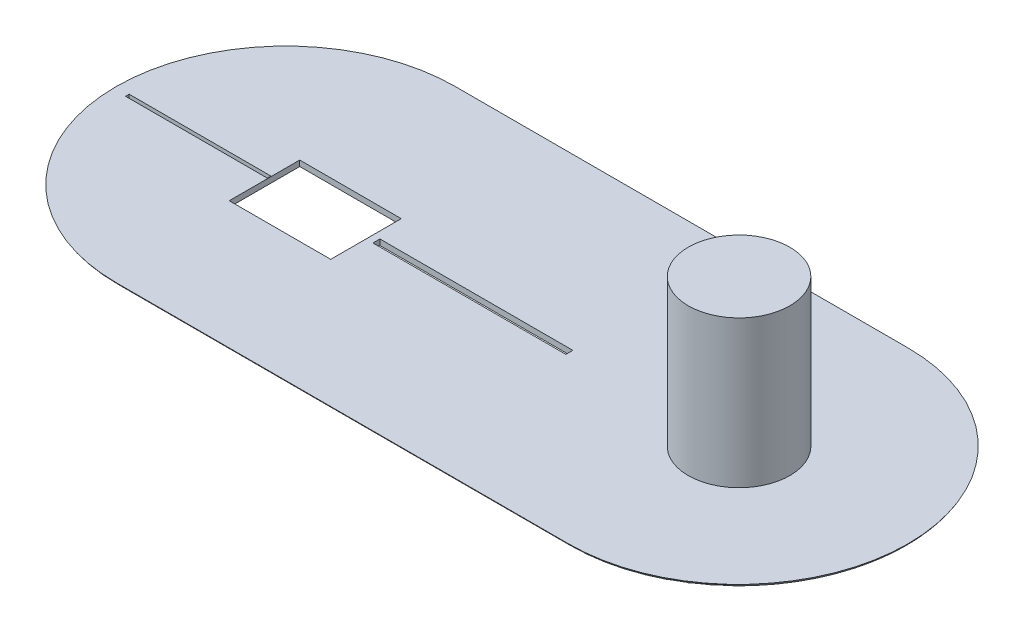
ISO-10303-21;
HEADER;
FILE_DESCRIPTION(('STEP AP214'),'2;1');
FILE_NAME('part.step','',(''),(''),'','','');
FILE_SCHEMA(('AUTOMOTIVE_DESIGN { 1 0 10303 214 1 1 1 1 }'));
ENDSEC;
DATA;
#1=APPLICATION_CONTEXT('core data for automotive mechanical design processes');
#2=APPLICATION_PROTOCOL_DEFINITION('international standard','automotive_design',2000,#1);
#3=PRODUCT_CONTEXT('',#1,'mechanical');
#4=PRODUCT('Part','Part','',(#3));
#5=PRODUCT_RELATED_PRODUCT_CATEGORY('part','',(#4));
#6=PRODUCT_DEFINITION_FORMATION('','',#4);
#7=PRODUCT_DEFINITION_CONTEXT('part definition',#1,'design');
#8=PRODUCT_DEFINITION('design','',#6,#7);
#9=PRODUCT_DEFINITION_SHAPE('','',#8);
#10=(LENGTH_UNIT() NAMED_UNIT(*) SI_UNIT(.MILLI.,.METRE.));
#11=(NAMED_UNIT(*) PLANE_ANGLE_UNIT() SI_UNIT($,.RADIAN.));
#12=(NAMED_UNIT(*) SI_UNIT($,.STERADIAN.) SOLID_ANGLE_UNIT());
#13=UNCERTAINTY_MEASURE_WITH_UNIT(LENGTH_MEASURE(1.E-05),#10,'distance_accuracy_value','');
#14=(GEOMETRIC_REPRESENTATION_CONTEXT(3) GLOBAL_UNCERTAINTY_ASSIGNED_CONTEXT((#13)) GLOBAL_UNIT_ASSIGNED_CONTEXT((#10,
#11,#12)) REPRESENTATION_CONTEXT('',''));
#15=CARTESIAN_POINT('',(0.,0.,0.));
#16=DIRECTION('',(0.,0.,1.));
#17=DIRECTION('',(1.,0.,0.));
#18=AXIS2_PLACEMENT_3D('',#15,#16,#17);
#19=CARTESIAN_POINT('',(-42.3139588100687,1.27,0.));
#20=DIRECTION('',(0.,1.,0.));
#21=DIRECTION('',(0.,0.,1.));
#22=AXIS2_PLACEMENT_3D('',#19,#20,#21);
#23=PLANE('',#22);
#24=DIRECTION('',(0.,0.,1.));
#25=VECTOR('',#24,1.);
#26=CARTESIAN_POINT('',(-77.4616347759732,1.27,0.));
#27=LINE('',#26,#25);
#28=CARTESIAN_POINT('',(-77.4616347759732,1.27,0.));
#29=VERTEX_POINT('',#28);
#30=CARTESIAN_POINT('',(-77.4616347759732,1.27,0.811195954050724));
#31=VERTEX_POINT('',#30);
#32=EDGE_CURVE('E209',#29,#31,#27,.T.);
#33=ORIENTED_EDGE('',*,*,#32,.F.);
#34=DIRECTION('',(-1.,0.,0.));
#35=VECTOR('',#34,1.);
#36=CARTESIAN_POINT('',(-42.3139588100687,1.27,0.));
#37=LINE('',#36,#35);
#38=CARTESIAN_POINT('',(-45.6306337318258,1.27,0.));
#39=VERTEX_POINT('',#38);
#40=EDGE_CURVE('E204',#39,#29,#37,.T.);
#41=ORIENTED_EDGE('',*,*,#40,.F.);
#42=DIRECTION('',(0.,0.,-1.));
#43=VECTOR('',#42,1.);
#44=CARTESIAN_POINT('',(-45.6306337318258,1.27,0.));
#45=LINE('',#44,#43);
#46=CARTESIAN_POINT('',(-45.6306337318258,1.27,0.811195954050724));
#47=VERTEX_POINT('',#46);
#48=EDGE_CURVE('E152',#47,#39,#45,.T.);
#49=ORIENTED_EDGE('',*,*,#48,.F.);
#50=DIRECTION('',(1.,0.,0.));
#51=VECTOR('',#50,1.);
#52=CARTESIAN_POINT('',(-42.3139588100687,1.27,0.811195954050724));
#53=LINE('',#52,#51);
#54=EDGE_CURVE('E207',#31,#47,#53,.T.);
#55=ORIENTED_EDGE('',*,*,#54,.F.);
#56=EDGE_LOOP('',(#33,#41,#49,#55));
#57=FACE_BOUND('',#56,.T.);
#58=DIRECTION('',(0.,0.,1.));
#59=VECTOR('',#58,1.);
#60=CARTESIAN_POINT('',(-21.1665375522872,1.27,0.));
#61=LINE('',#60,#59);
#62=CARTESIAN_POINT('',(-21.1665375522872,1.27,0.));
#63=VERTEX_POINT('',#62);
#64=CARTESIAN_POINT('',(-21.1665375522872,1.27,1.56940879190157));
#65=VERTEX_POINT('',#64);
#66=EDGE_CURVE('E202',#63,#65,#61,.T.);
#67=ORIENTED_EDGE('',*,*,#66,.F.);
#68=DIRECTION('',(-1.,0.,0.));
#69=VECTOR('',#68,1.);
#70=CARTESIAN_POINT('',(-42.3139588100687,1.27,0.));
#71=LINE('',#70,#69);
#72=CARTESIAN_POINT('',(22.1438046169267,1.27,0.));
#73=VERTEX_POINT('',#72);
#74=EDGE_CURVE('E176',#73,#63,#71,.T.);
#75=ORIENTED_EDGE('',*,*,#74,.F.);
#76=DIRECTION('',(0.,0.,-1.));
#77=VECTOR('',#76,1.);
#78=CARTESIAN_POINT('',(22.1438046169267,1.27,0.));
#79=LINE('',#78,#77);
#80=CARTESIAN_POINT('',(22.1438046169267,1.27,1.56940879190157));
#81=VERTEX_POINT('',#80);
#82=EDGE_CURVE('E198',#81,#73,#79,.T.);
#83=ORIENTED_EDGE('',*,*,#82,.F.);
#84=DIRECTION('',(1.,0.,0.));
#85=VECTOR('',#84,1.);
#86=CARTESIAN_POINT('',(-42.3139588100687,1.27,1.56940879190157));
#87=LINE('',#86,#85);
#88=EDGE_CURVE('E200',#65,#81,#87,.T.);
#89=ORIENTED_EDGE('',*,*,#88,.F.);
#90=EDGE_LOOP('',(#67,#75,#83,#89));
#91=FACE_BOUND('',#90,.T.);
#92=DIRECTION('',(0.,0.,1.));
#93=VECTOR('',#92,1.);
#94=CARTESIAN_POINT('',(-45.519073569725,1.27,9.48349138702095));
#95=LINE('',#94,#93);
#96=CARTESIAN_POINT('',(-45.519073569725,1.27,-6.34467380321782));
#97=VERTEX_POINT('',#96);
#98=CARTESIAN_POINT('',(-45.519073569725,1.27,9.48349138702095));
#99=VERTEX_POINT('',#98);
#100=EDGE_CURVE('E212',#97,#99,#95,.T.);
#101=ORIENTED_EDGE('',*,*,#100,.F.);
#102=DIRECTION('',(-1.,0.,0.));
#103=VECTOR('',#102,1.);
#104=CARTESIAN_POINT('',(-45.519073569725,1.27,-6.34467380321782));
#105=LINE('',#104,#103);
#106=CARTESIAN_POINT('',(-22.7265156957812,1.27,-6.34467380321782));
#107=VERTEX_POINT('',#106);
#108=EDGE_CURVE('E220',#107,#97,#105,.T.);
#109=ORIENTED_EDGE('',*,*,#108,.F.);
#110=DIRECTION('',(0.,0.,-1.));
#111=VECTOR('',#110,1.);
#112=CARTESIAN_POINT('',(-22.7265156957812,1.27,9.48349138702095));
#113=LINE('',#112,#111);
#114=CARTESIAN_POINT('',(-22.7265156957812,1.27,9.48349138702095));
#115=VERTEX_POINT('',#114);
#116=EDGE_CURVE('E217',#115,#107,#113,.T.);
#117=ORIENTED_EDGE('',*,*,#116,.F.);
#118=DIRECTION('',(1.,0.,0.));
#119=VECTOR('',#118,1.);
#120=CARTESIAN_POINT('',(-45.519073569725,1.27,9.48349138702095));
#121=LINE('',#120,#119);
#122=EDGE_CURVE('E214',#99,#115,#121,.T.);
#123=ORIENTED_EDGE('',*,*,#122,.F.);
#124=EDGE_LOOP('',(#101,#109,#117,#123));
#125=FACE_BOUND('',#124,.T.);
#126=CARTESIAN_POINT('',(59.4608738266871,1.27,0.));
#127=DIRECTION('',(0.,1.,0.));
#128=DIRECTION('',(0.,0.,1.));
#129=AXIS2_PLACEMENT_3D('',#126,#127,#128);
#130=CIRCLE('',#129,11.4029964034048);
#131=CARTESIAN_POINT('',(59.4608738266871,1.27,11.4029964034048));
#132=VERTEX_POINT('',#131);
#133=EDGE_CURVE('E226',#132,#132,#130,.T.);
#134=ORIENTED_EDGE('',*,*,#133,.F.);
#135=EDGE_LOOP('',(#134));
#136=FACE_BOUND('',#135,.T.);
#137=CARTESIAN_POINT('',(-42.3139588100687,1.27,0.));
#138=DIRECTION('',(0.,1.,0.));
#139=DIRECTION('',(0.,0.,1.));
#140=AXIS2_PLACEMENT_3D('',#137,#138,#139);
#141=CIRCLE('',#140,38.1);
#142=CARTESIAN_POINT('',(-42.3139588100687,1.27,-38.1));
#143=VERTEX_POINT('',#142);
#144=CARTESIAN_POINT('',(-42.3139588100687,1.27,38.1));
#145=VERTEX_POINT('',#144);
#146=EDGE_CURVE('E236',#143,#145,#141,.T.);
#147=ORIENTED_EDGE('',*,*,#146,.T.);
#148=DIRECTION('',(1.,0.,0.));
#149=VECTOR('',#148,1.);
#150=CARTESIAN_POINT('',(-42.3139588100687,1.27,38.1));
#151=LINE('',#150,#149);
#152=CARTESIAN_POINT('',(59.2860411899313,1.27,38.1));
#153=VERTEX_POINT('',#152);
#154=EDGE_CURVE('E241',#145,#153,#151,.T.);
#155=ORIENTED_EDGE('',*,*,#154,.T.);
#156=CARTESIAN_POINT('',(59.2860411899313,1.27,0.));
#157=DIRECTION('',(0.,1.,0.));
#158=DIRECTION('',(0.,0.,1.));
#159=AXIS2_PLACEMENT_3D('',#156,#157,#158);
#160=CIRCLE('',#159,38.1);
#161=CARTESIAN_POINT('',(59.2860411899313,1.27,-38.1));
#162=VERTEX_POINT('',#161);
#163=EDGE_CURVE('E243',#153,#162,#160,.T.);
#164=ORIENTED_EDGE('',*,*,#163,.T.);
#165=DIRECTION('',(1.,0.,0.));
#166=VECTOR('',#165,1.);
#167=CARTESIAN_POINT('',(-42.3139588100687,1.27,-38.1));
#168=LINE('',#167,#166);
#169=EDGE_CURVE('E245',#143,#162,#168,.T.);
#170=ORIENTED_EDGE('',*,*,#169,.F.);
#171=EDGE_LOOP('',(#147,#155,#164,#170));
#172=FACE_BOUND('',#171,.T.);
#173=ADVANCED_FACE('F32',(#57,#91,#125,#136,#172),#23,.T.);
#174=CARTESIAN_POINT('',(-42.3139588100687,0.,0.));
#175=DIRECTION('',(0.,1.,0.));
#176=DIRECTION('',(0.,0.,1.));
#177=AXIS2_PLACEMENT_3D('',#174,#175,#176);
#178=PLANE('',#177);
#179=DIRECTION('',(1.,0.,0.));
#180=VECTOR('',#179,1.);
#181=CARTESIAN_POINT('',(-77.4616347759732,0.,0.));
#182=LINE('',#181,#180);
#183=CARTESIAN_POINT('',(-77.4616347759732,0.,0.));
#184=VERTEX_POINT('',#183);
#185=CARTESIAN_POINT('',(-45.6306337318258,0.,0.));
#186=VERTEX_POINT('',#185);
#187=EDGE_CURVE('E159',#184,#186,#182,.T.);
#188=ORIENTED_EDGE('',*,*,#187,.F.);
#189=DIRECTION('',(0.,0.,-1.));
#190=VECTOR('',#189,1.);
#191=CARTESIAN_POINT('',(-77.4616347759732,0.,0.));
#192=LINE('',#191,#190);
#193=CARTESIAN_POINT('',(-77.4616347759732,0.,0.811195954050724));
#194=VERTEX_POINT('',#193);
#195=EDGE_CURVE('E164',#194,#184,#192,.T.);
#196=ORIENTED_EDGE('',*,*,#195,.F.);
#197=DIRECTION('',(-1.,0.,0.));
#198=VECTOR('',#197,1.);
#199=CARTESIAN_POINT('',(-77.4616347759732,0.,0.811195954050724));
#200=LINE('',#199,#198);
#201=CARTESIAN_POINT('',(-45.6306337318258,0.,0.811195954050724));
#202=VERTEX_POINT('',#201);
#203=EDGE_CURVE('E169',#202,#194,#200,.T.);
#204=ORIENTED_EDGE('',*,*,#203,.F.);
#205=DIRECTION('',(0.,0.,1.));
#206=VECTOR('',#205,1.);
#207=CARTESIAN_POINT('',(-45.6306337318258,0.,0.));
#208=LINE('',#207,#206);
#209=EDGE_CURVE('E149',#186,#202,#208,.T.);
#210=ORIENTED_EDGE('',*,*,#209,.F.);
#211=EDGE_LOOP('',(#188,#196,#204,#210));
#212=FACE_BOUND('',#211,.T.);
#213=DIRECTION('',(1.,0.,0.));
#214=VECTOR('',#213,1.);
#215=CARTESIAN_POINT('',(-21.1665375522872,0.,0.));
#216=LINE('',#215,#214);
#217=CARTESIAN_POINT('',(-21.1665375522872,0.,0.));
#218=VERTEX_POINT('',#217);
#219=CARTESIAN_POINT('',(22.1438046169267,0.,0.));
#220=VERTEX_POINT('',#219);
#221=EDGE_CURVE('E181',#218,#220,#216,.T.);
#222=ORIENTED_EDGE('',*,*,#221,.F.);
#223=DIRECTION('',(0.,0.,-1.));
#224=VECTOR('',#223,1.);
#225=CARTESIAN_POINT('',(-21.1665375522872,0.,0.));
#226=LINE('',#225,#224);
#227=CARTESIAN_POINT('',(-21.1665375522872,0.,1.56940879190157));
#228=VERTEX_POINT('',#227);
#229=EDGE_CURVE('E179',#228,#218,#226,.T.);
#230=ORIENTED_EDGE('',*,*,#229,.F.);
#231=DIRECTION('',(-1.,0.,0.));
#232=VECTOR('',#231,1.);
#233=CARTESIAN_POINT('',(-21.1665375522872,0.,1.56940879190157));
#234=LINE('',#233,#232);
#235=CARTESIAN_POINT('',(22.1438046169267,0.,1.56940879190157));
#236=VERTEX_POINT('',#235);
#237=EDGE_CURVE('E186',#236,#228,#234,.T.);
#238=ORIENTED_EDGE('',*,*,#237,.F.);
#239=DIRECTION('',(0.,0.,1.));
#240=VECTOR('',#239,1.);
#241=CARTESIAN_POINT('',(22.1438046169267,0.,0.));
#242=LINE('',#241,#240);
#243=EDGE_CURVE('E183',#220,#236,#242,.T.);
#244=ORIENTED_EDGE('',*,*,#243,.F.);
#245=EDGE_LOOP('',(#222,#230,#238,#244));
#246=FACE_BOUND('',#245,.T.);
#247=DIRECTION('',(1.,0.,0.));
#248=VECTOR('',#247,1.);
#249=CARTESIAN_POINT('',(-42.3139588100687,0.,35.9002954743875));
#250=LINE('',#249,#248);
#251=CARTESIAN_POINT('',(59.2860411899313,0.,35.9002954743875));
#252=VERTEX_POINT('',#251);
#253=CARTESIAN_POINT('',(-42.3139588100687,0.,35.9002954743875));
#254=VERTEX_POINT('',#253);
#255=EDGE_CURVE('E41',#252,#254,#250,.F.);
#256=ORIENTED_EDGE('',*,*,#255,.T.);
#257=CARTESIAN_POINT('',(-42.3139588100687,0.,0.));
#258=DIRECTION('',(0.,1.,0.));
#259=DIRECTION('',(0.,0.,1.));
#260=AXIS2_PLACEMENT_3D('',#257,#258,#259);
#261=CIRCLE('',#260,35.9002954743875);
#262=CARTESIAN_POINT('',(-42.3139588100687,0.,-35.9002954743875));
#263=VERTEX_POINT('',#262);
#264=EDGE_CURVE('E11',#254,#263,#261,.F.);
#265=ORIENTED_EDGE('',*,*,#264,.T.);
#266=DIRECTION('',(1.,0.,0.));
#267=VECTOR('',#266,1.);
#268=CARTESIAN_POINT('',(-42.3139588100687,0.,-35.9002954743875));
#269=LINE('',#268,#267);
#270=CARTESIAN_POINT('',(59.2860411899313,0.,-35.9002954743875));
#271=VERTEX_POINT('',#270);
#272=EDGE_CURVE('E260',#263,#271,#269,.T.);
#273=ORIENTED_EDGE('',*,*,#272,.T.);
#274=CARTESIAN_POINT('',(59.2860411899313,0.,0.));
#275=DIRECTION('',(0.,1.,0.));
#276=DIRECTION('',(0.,0.,1.));
#277=AXIS2_PLACEMENT_3D('',#274,#275,#276);
#278=CIRCLE('',#277,35.9002954743875);
#279=EDGE_CURVE('E262',#271,#252,#278,.F.);
#280=ORIENTED_EDGE('',*,*,#279,.T.);
#281=EDGE_LOOP('',(#256,#265,#273,#280));
#282=FACE_BOUND('',#281,.T.);
#283=DIRECTION('',(-1.,0.,0.));
#284=VECTOR('',#283,1.);
#285=CARTESIAN_POINT('',(-42.3139588100687,0.,-6.34467380321782));
#286=LINE('',#285,#284);
#287=CARTESIAN_POINT('',(-22.7265156957812,0.,-6.34467380321782));
#288=VERTEX_POINT('',#287);
#289=CARTESIAN_POINT('',(-45.519073569725,0.,-6.34467380321782));
#290=VERTEX_POINT('',#289);
#291=EDGE_CURVE('E254',#288,#290,#286,.T.);
#292=ORIENTED_EDGE('',*,*,#291,.T.);
#293=DIRECTION('',(0.,0.,1.));
#294=VECTOR('',#293,1.);
#295=CARTESIAN_POINT('',(-45.519073569725,0.,0.));
#296=LINE('',#295,#294);
#297=CARTESIAN_POINT('',(-45.519073569725,0.,9.48349138702095));
#298=VERTEX_POINT('',#297);
#299=EDGE_CURVE('E257',#290,#298,#296,.T.);
#300=ORIENTED_EDGE('',*,*,#299,.T.);
#301=DIRECTION('',(1.,0.,0.));
#302=VECTOR('',#301,1.);
#303=CARTESIAN_POINT('',(-42.3139588100687,0.,9.48349138702095));
#304=LINE('',#303,#302);
#305=CARTESIAN_POINT('',(-22.7265156957812,0.,9.48349138702095));
#306=VERTEX_POINT('',#305);
#307=EDGE_CURVE('E248',#298,#306,#304,.T.);
#308=ORIENTED_EDGE('',*,*,#307,.T.);
#309=DIRECTION('',(0.,0.,-1.));
#310=VECTOR('',#309,1.);
#311=CARTESIAN_POINT('',(-22.7265156957812,0.,0.));
#312=LINE('',#311,#310);
#313=EDGE_CURVE('E251',#306,#288,#312,.T.);
#314=ORIENTED_EDGE('',*,*,#313,.T.);
#315=EDGE_LOOP('',(#292,#300,#308,#314));
#316=FACE_BOUND('',#315,.T.);
#317=ADVANCED_FACE('F166',(#212,#246,#282,#316),#178,.F.);
#318=CARTESIAN_POINT('',(59.4608738266871,34.29,0.));
#319=DIRECTION('',(0.,-1.,0.));
#320=DIRECTION('',(0.,0.,-1.));
#321=AXIS2_PLACEMENT_3D('',#318,#319,#320);
#322=CYLINDRICAL_SURFACE('',#321,11.4029964034048);
#323=CARTESIAN_POINT('',(59.4608738266871,34.29,0.));
#324=DIRECTION('',(0.,1.,0.));
#325=DIRECTION('',(0.,0.,1.));
#326=AXIS2_PLACEMENT_3D('',#323,#324,#325);
#327=CIRCLE('',#326,11.4029964034048);
#328=CARTESIAN_POINT('',(59.4608738266871,34.29,11.4029964034048));
#329=VERTEX_POINT('',#328);
#330=EDGE_CURVE('E233',#329,#329,#327,.T.);
#331=ORIENTED_EDGE('',*,*,#330,.F.);
#332=EDGE_LOOP('',(#331));
#333=FACE_BOUND('',#332,.T.);
#334=ORIENTED_EDGE('',*,*,#133,.T.);
#335=EDGE_LOOP('',(#334));
#336=FACE_BOUND('',#335,.T.);
#337=ADVANCED_FACE('F297',(#333,#336),#322,.T.);
#338=CARTESIAN_POINT('',(59.4608738266871,34.29,0.));
#339=DIRECTION('',(0.,1.,0.));
#340=DIRECTION('',(0.,0.,1.));
#341=AXIS2_PLACEMENT_3D('',#338,#339,#340);
#342=PLANE('',#341);
#343=ORIENTED_EDGE('',*,*,#330,.T.);
#344=EDGE_LOOP('',(#343));
#345=FACE_BOUND('',#344,.T.);
#346=ADVANCED_FACE('F329',(#345),#342,.T.);
#347=CARTESIAN_POINT('',(-45.519073569725,-11.43,9.48349138702095));
#348=DIRECTION('',(-1.,0.,0.));
#349=DIRECTION('',(0.,0.,1.));
#350=AXIS2_PLACEMENT_3D('',#347,#348,#349);
#351=PLANE('',#350);
#352=DIRECTION('',(0.,1.,0.));
#353=VECTOR('',#352,1.);
#354=CARTESIAN_POINT('',(-45.519073569725,-11.43,-6.34467380321782));
#355=LINE('',#354,#353);
#356=EDGE_CURVE('E224',#290,#97,#355,.T.);
#357=ORIENTED_EDGE('',*,*,#356,.T.);
#358=ORIENTED_EDGE('',*,*,#100,.T.);
#359=DIRECTION('',(0.,1.,0.));
#360=VECTOR('',#359,1.);
#361=CARTESIAN_POINT('',(-45.519073569725,-11.43,9.48349138702095));
#362=LINE('',#361,#360);
#363=EDGE_CURVE('E223',#298,#99,#362,.T.);
#364=ORIENTED_EDGE('',*,*,#363,.F.);
#365=ORIENTED_EDGE('',*,*,#299,.F.);
#366=EDGE_LOOP('',(#357,#358,#364,#365));
#367=FACE_BOUND('',#366,.T.);
#368=ADVANCED_FACE('F327',(#367),#351,.F.);
#369=CARTESIAN_POINT('',(-45.519073569725,-11.43,-6.34467380321782));
#370=DIRECTION('',(0.,0.,-1.));
#371=DIRECTION('',(-1.,0.,0.));
#372=AXIS2_PLACEMENT_3D('',#369,#370,#371);
#373=PLANE('',#372);
#374=DIRECTION('',(0.,1.,0.));
#375=VECTOR('',#374,1.);
#376=CARTESIAN_POINT('',(-22.7265156957812,-11.43,-6.34467380321782));
#377=LINE('',#376,#375);
#378=EDGE_CURVE('E227',#288,#107,#377,.T.);
#379=ORIENTED_EDGE('',*,*,#378,.T.);
#380=ORIENTED_EDGE('',*,*,#108,.T.);
#381=ORIENTED_EDGE('',*,*,#356,.F.);
#382=ORIENTED_EDGE('',*,*,#291,.F.);
#383=EDGE_LOOP('',(#379,#380,#381,#382));
#384=FACE_BOUND('',#383,.T.);
#385=ADVANCED_FACE('F322',(#384),#373,.F.);
#386=CARTESIAN_POINT('',(-22.7265156957812,-11.43,9.48349138702095));
#387=DIRECTION('',(1.,0.,0.));
#388=DIRECTION('',(0.,0.,-1.));
#389=AXIS2_PLACEMENT_3D('',#386,#387,#388);
#390=PLANE('',#389);
#391=DIRECTION('',(0.,1.,0.));
#392=VECTOR('',#391,1.);
#393=CARTESIAN_POINT('',(-22.7265156957812,-11.43,9.48349138702095));
#394=LINE('',#393,#392);
#395=EDGE_CURVE('E229',#306,#115,#394,.T.);
#396=ORIENTED_EDGE('',*,*,#395,.T.);
#397=ORIENTED_EDGE('',*,*,#116,.T.);
#398=ORIENTED_EDGE('',*,*,#378,.F.);
#399=ORIENTED_EDGE('',*,*,#313,.F.);
#400=EDGE_LOOP('',(#396,#397,#398,#399));
#401=FACE_BOUND('',#400,.T.);
#402=ADVANCED_FACE('F316',(#401),#390,.F.);
#403=CARTESIAN_POINT('',(-45.519073569725,-11.43,9.48349138702095));
#404=DIRECTION('',(0.,0.,1.));
#405=DIRECTION('',(1.,0.,0.));
#406=AXIS2_PLACEMENT_3D('',#403,#404,#405);
#407=PLANE('',#406);
#408=ORIENTED_EDGE('',*,*,#363,.T.);
#409=ORIENTED_EDGE('',*,*,#122,.T.);
#410=ORIENTED_EDGE('',*,*,#395,.F.);
#411=ORIENTED_EDGE('',*,*,#307,.F.);
#412=EDGE_LOOP('',(#408,#409,#410,#411));
#413=FACE_BOUND('',#412,.T.);
#414=ADVANCED_FACE('F312',(#413),#407,.F.);
#415=CARTESIAN_POINT('',(59.2860411899313,2.54,0.));
#416=DIRECTION('',(0.,-1.,0.));
#417=DIRECTION('',(0.,0.,-1.));
#418=AXIS2_PLACEMENT_3D('',#415,#416,#417);
#419=TOROIDAL_SURFACE('',#418,35.9002954743875,2.54);
#420=CARTESIAN_POINT('',(59.2860411899313,2.54,35.9002954743875));
#421=DIRECTION('',(-1.,0.,0.));
#422=DIRECTION('',(0.,0.,1.));
#423=AXIS2_PLACEMENT_3D('',#420,#421,#422);
#424=CIRCLE('',#423,2.54);
#425=EDGE_CURVE('E267',#252,#153,#424,.T.);
#426=ORIENTED_EDGE('',*,*,#425,.F.);
#427=ORIENTED_EDGE('',*,*,#279,.F.);
#428=CARTESIAN_POINT('',(59.2860411899313,2.54,-35.9002954743874));
#429=DIRECTION('',(-1.,0.,0.));
#430=DIRECTION('',(0.,0.,1.));
#431=AXIS2_PLACEMENT_3D('',#428,#429,#430);
#432=CIRCLE('',#431,2.54);
#433=EDGE_CURVE('E36',#162,#271,#432,.T.);
#434=ORIENTED_EDGE('',*,*,#433,.F.);
#435=ORIENTED_EDGE('',*,*,#163,.F.);
#436=EDGE_LOOP('',(#426,#427,#434,#435));
#437=FACE_BOUND('',#436,.T.);
#438=ADVANCED_FACE('F34',(#437),#419,.T.);
#439=CARTESIAN_POINT('',(-42.3139588100687,2.54,-35.9002954743875));
#440=DIRECTION('',(1.,0.,0.));
#441=DIRECTION('',(0.,0.,-1.));
#442=AXIS2_PLACEMENT_3D('',#439,#440,#441);
#443=CYLINDRICAL_SURFACE('',#442,2.54);
#444=ORIENTED_EDGE('',*,*,#433,.T.);
#445=ORIENTED_EDGE('',*,*,#272,.F.);
#446=CARTESIAN_POINT('',(-42.3139588100687,2.54,-35.9002954743874));
#447=DIRECTION('',(-1.,0.,0.));
#448=DIRECTION('',(0.,0.,1.));
#449=AXIS2_PLACEMENT_3D('',#446,#447,#448);
#450=CIRCLE('',#449,2.54);
#451=EDGE_CURVE('E266',#143,#263,#450,.T.);
#452=ORIENTED_EDGE('',*,*,#451,.F.);
#453=ORIENTED_EDGE('',*,*,#169,.T.);
#454=EDGE_LOOP('',(#444,#445,#452,#453));
#455=FACE_BOUND('',#454,.T.);
#456=ADVANCED_FACE('F277',(#455),#443,.T.);
#457=CARTESIAN_POINT('',(-42.3139588100687,2.54,35.9002954743875));
#458=DIRECTION('',(1.,0.,0.));
#459=DIRECTION('',(0.,0.,-1.));
#460=AXIS2_PLACEMENT_3D('',#457,#458,#459);
#461=CYLINDRICAL_SURFACE('',#460,2.54);
#462=ORIENTED_EDGE('',*,*,#425,.T.);
#463=ORIENTED_EDGE('',*,*,#154,.F.);
#464=CARTESIAN_POINT('',(-42.3139588100687,2.54,35.9002954743875));
#465=DIRECTION('',(-1.,0.,0.));
#466=DIRECTION('',(0.,0.,1.));
#467=AXIS2_PLACEMENT_3D('',#464,#465,#466);
#468=CIRCLE('',#467,2.54);
#469=EDGE_CURVE('E211',#254,#145,#468,.T.);
#470=ORIENTED_EDGE('',*,*,#469,.F.);
#471=ORIENTED_EDGE('',*,*,#255,.F.);
#472=EDGE_LOOP('',(#462,#463,#470,#471));
#473=FACE_BOUND('',#472,.T.);
#474=ADVANCED_FACE('F289',(#473),#461,.T.);
#475=CARTESIAN_POINT('',(-42.3139588100687,2.54,0.));
#476=DIRECTION('',(0.,-1.,0.));
#477=DIRECTION('',(0.,0.,-1.));
#478=AXIS2_PLACEMENT_3D('',#475,#476,#477);
#479=TOROIDAL_SURFACE('',#478,35.9002954743875,2.54);
#480=ORIENTED_EDGE('',*,*,#451,.T.);
#481=ORIENTED_EDGE('',*,*,#264,.F.);
#482=ORIENTED_EDGE('',*,*,#469,.T.);
#483=ORIENTED_EDGE('',*,*,#146,.F.);
#484=EDGE_LOOP('',(#480,#481,#482,#483));
#485=FACE_BOUND('',#484,.T.);
#486=ADVANCED_FACE('F287',(#485),#479,.T.);
#487=CARTESIAN_POINT('',(-21.1665375522872,22.86,0.));
#488=DIRECTION('',(-1.,0.,0.));
#489=DIRECTION('',(0.,0.,1.));
#490=AXIS2_PLACEMENT_3D('',#487,#488,#489);
#491=PLANE('',#490);
#492=ORIENTED_EDGE('',*,*,#66,.T.);
#493=DIRECTION('',(0.,-1.,0.));
#494=VECTOR('',#493,1.);
#495=CARTESIAN_POINT('',(-21.1665375522872,22.86,1.56940879190157));
#496=LINE('',#495,#494);
#497=EDGE_CURVE('E190',#65,#228,#496,.T.);
#498=ORIENTED_EDGE('',*,*,#497,.T.);
#499=ORIENTED_EDGE('',*,*,#229,.T.);
#500=DIRECTION('',(0.,-1.,0.));
#501=VECTOR('',#500,1.);
#502=CARTESIAN_POINT('',(-21.1665375522872,22.86,0.));
#503=LINE('',#502,#501);
#504=EDGE_CURVE('E189',#63,#218,#503,.T.);
#505=ORIENTED_EDGE('',*,*,#504,.F.);
#506=EDGE_LOOP('',(#492,#498,#499,#505));
#507=FACE_BOUND('',#506,.T.);
#508=ADVANCED_FACE('F306',(#507),#491,.F.);
#509=CARTESIAN_POINT('',(-21.1665375522872,22.86,1.56940879190157));
#510=DIRECTION('',(0.,0.,1.));
#511=DIRECTION('',(1.,0.,0.));
#512=AXIS2_PLACEMENT_3D('',#509,#510,#511);
#513=PLANE('',#512);
#514=ORIENTED_EDGE('',*,*,#88,.T.);
#515=DIRECTION('',(0.,-1.,0.));
#516=VECTOR('',#515,1.);
#517=CARTESIAN_POINT('',(22.1438046169267,22.86,1.56940879190157));
#518=LINE('',#517,#516);
#519=EDGE_CURVE('E192',#81,#236,#518,.T.);
#520=ORIENTED_EDGE('',*,*,#519,.T.);
#521=ORIENTED_EDGE('',*,*,#237,.T.);
#522=ORIENTED_EDGE('',*,*,#497,.F.);
#523=EDGE_LOOP('',(#514,#520,#521,#522));
#524=FACE_BOUND('',#523,.T.);
#525=ADVANCED_FACE('F359',(#524),#513,.F.);
#526=CARTESIAN_POINT('',(22.1438046169267,22.86,0.));
#527=DIRECTION('',(1.,0.,0.));
#528=DIRECTION('',(0.,0.,-1.));
#529=AXIS2_PLACEMENT_3D('',#526,#527,#528);
#530=PLANE('',#529);
#531=ORIENTED_EDGE('',*,*,#82,.T.);
#532=DIRECTION('',(0.,-1.,0.));
#533=VECTOR('',#532,1.);
#534=CARTESIAN_POINT('',(22.1438046169267,22.86,0.));
#535=LINE('',#534,#533);
#536=EDGE_CURVE('E57',#73,#220,#535,.T.);
#537=ORIENTED_EDGE('',*,*,#536,.T.);
#538=ORIENTED_EDGE('',*,*,#243,.T.);
#539=ORIENTED_EDGE('',*,*,#519,.F.);
#540=EDGE_LOOP('',(#531,#537,#538,#539));
#541=FACE_BOUND('',#540,.T.);
#542=ADVANCED_FACE('F370',(#541),#530,.F.);
#543=CARTESIAN_POINT('',(-21.1665375522872,22.86,0.));
#544=DIRECTION('',(0.,0.,-1.));
#545=DIRECTION('',(-1.,0.,0.));
#546=AXIS2_PLACEMENT_3D('',#543,#544,#545);
#547=PLANE('',#546);
#548=ORIENTED_EDGE('',*,*,#74,.T.);
#549=ORIENTED_EDGE('',*,*,#504,.T.);
#550=ORIENTED_EDGE('',*,*,#221,.T.);
#551=ORIENTED_EDGE('',*,*,#536,.F.);
#552=EDGE_LOOP('',(#548,#549,#550,#551));
#553=FACE_BOUND('',#552,.T.);
#554=ADVANCED_FACE('F380',(#553),#547,.F.);
#555=CARTESIAN_POINT('',(-77.4616347759732,22.86,0.));
#556=DIRECTION('',(-1.,0.,0.));
#557=DIRECTION('',(0.,0.,1.));
#558=AXIS2_PLACEMENT_3D('',#555,#556,#557);
#559=PLANE('',#558);
#560=ORIENTED_EDGE('',*,*,#32,.T.);
#561=DIRECTION('',(0.,-1.,0.));
#562=VECTOR('',#561,1.);
#563=CARTESIAN_POINT('',(-77.4616347759732,22.86,0.811195954050724));
#564=LINE('',#563,#562);
#565=EDGE_CURVE('E174',#31,#194,#564,.T.);
#566=ORIENTED_EDGE('',*,*,#565,.T.);
#567=ORIENTED_EDGE('',*,*,#195,.T.);
#568=DIRECTION('',(0.,-1.,0.));
#569=VECTOR('',#568,1.);
#570=CARTESIAN_POINT('',(-77.4616347759732,22.86,0.));
#571=LINE('',#570,#569);
#572=EDGE_CURVE('E155',#29,#184,#571,.T.);
#573=ORIENTED_EDGE('',*,*,#572,.F.);
#574=EDGE_LOOP('',(#560,#566,#567,#573));
#575=FACE_BOUND('',#574,.T.);
#576=ADVANCED_FACE('F390',(#575),#559,.F.);
#577=CARTESIAN_POINT('',(-77.4616347759732,22.86,0.811195954050724));
#578=DIRECTION('',(0.,0.,1.));
#579=DIRECTION('',(1.,0.,0.));
#580=AXIS2_PLACEMENT_3D('',#577,#578,#579);
#581=PLANE('',#580);
#582=ORIENTED_EDGE('',*,*,#54,.T.);
#583=DIRECTION('',(0.,-1.,0.));
#584=VECTOR('',#583,1.);
#585=CARTESIAN_POINT('',(-45.6306337318258,22.86,0.811195954050724));
#586=LINE('',#585,#584);
#587=EDGE_CURVE('E154',#47,#202,#586,.T.);
#588=ORIENTED_EDGE('',*,*,#587,.T.);
#589=ORIENTED_EDGE('',*,*,#203,.T.);
#590=ORIENTED_EDGE('',*,*,#565,.F.);
#591=EDGE_LOOP('',(#582,#588,#589,#590));
#592=FACE_BOUND('',#591,.T.);
#593=ADVANCED_FACE('F399',(#592),#581,.F.);
#594=CARTESIAN_POINT('',(-45.6306337318258,22.86,0.));
#595=DIRECTION('',(1.,0.,0.));
#596=DIRECTION('',(0.,0.,-1.));
#597=AXIS2_PLACEMENT_3D('',#594,#595,#596);
#598=PLANE('',#597);
#599=ORIENTED_EDGE('',*,*,#48,.T.);
#600=DIRECTION('',(0.,-1.,0.));
#601=VECTOR('',#600,1.);
#602=CARTESIAN_POINT('',(-45.6306337318258,22.86,0.));
#603=LINE('',#602,#601);
#604=EDGE_CURVE('E49',#39,#186,#603,.T.);
#605=ORIENTED_EDGE('',*,*,#604,.T.);
#606=ORIENTED_EDGE('',*,*,#209,.T.);
#607=ORIENTED_EDGE('',*,*,#587,.F.);
#608=EDGE_LOOP('',(#599,#605,#606,#607));
#609=FACE_BOUND('',#608,.T.);
#610=ADVANCED_FACE('F146',(#609),#598,.F.);
#611=CARTESIAN_POINT('',(-77.4616347759732,22.86,0.));
#612=DIRECTION('',(0.,0.,-1.));
#613=DIRECTION('',(-1.,0.,0.));
#614=AXIS2_PLACEMENT_3D('',#611,#612,#613);
#615=PLANE('',#614);
#616=ORIENTED_EDGE('',*,*,#40,.T.);
#617=ORIENTED_EDGE('',*,*,#572,.T.);
#618=ORIENTED_EDGE('',*,*,#187,.T.);
#619=ORIENTED_EDGE('',*,*,#604,.F.);
#620=EDGE_LOOP('',(#616,#617,#618,#619));
#621=FACE_BOUND('',#620,.T.);
#622=ADVANCED_FACE('F160',(#621),#615,.F.);
#623=CLOSED_SHELL('',(#173,#317,#337,#346,#368,#385,#402,#414,#438,#456,#474,#486,#508,#525,
#542,#554,#576,#593,#610,#622));
#624=MANIFOLD_SOLID_BREP('B2',#623);
#625=ADVANCED_BREP_SHAPE_REPRESENTATION('',(#18,#624),#14);
#626=SHAPE_DEFINITION_REPRESENTATION(#9,#625);
ENDSEC;
END-ISO-10303-21;
